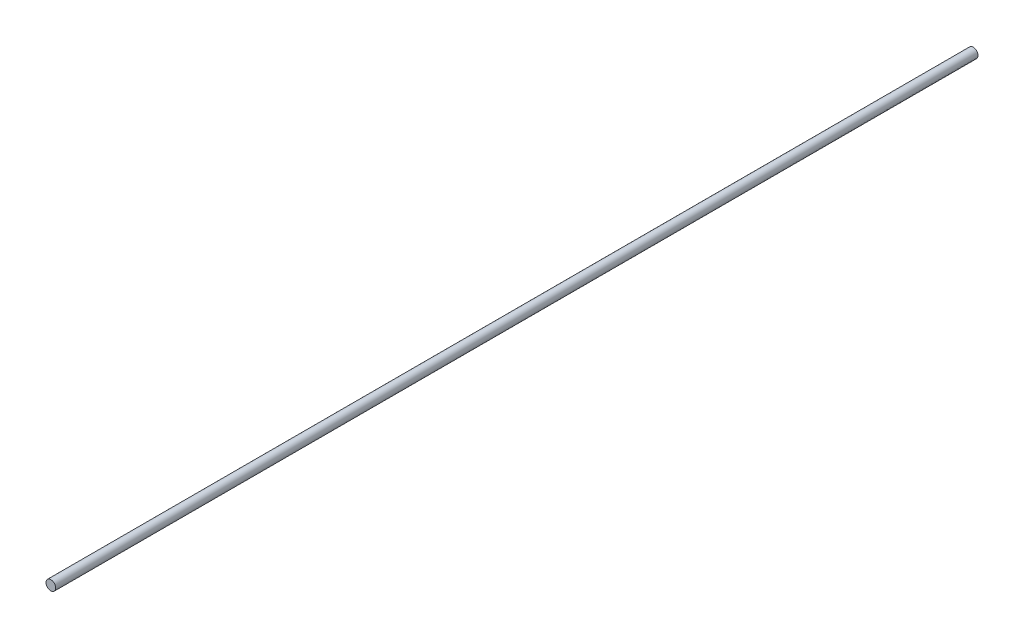
ISO-10303-21;
HEADER;
FILE_DESCRIPTION(('STEP AP214'),'2;1');
FILE_NAME('part.step','',(''),(''),'','','');
FILE_SCHEMA(('AUTOMOTIVE_DESIGN { 1 0 10303 214 1 1 1 1 }'));
ENDSEC;
DATA;
#1=APPLICATION_CONTEXT('core data for automotive mechanical design processes');
#2=APPLICATION_PROTOCOL_DEFINITION('international standard','automotive_design',2000,#1);
#3=PRODUCT_CONTEXT('',#1,'mechanical');
#4=PRODUCT('Part','Part','',(#3));
#5=PRODUCT_RELATED_PRODUCT_CATEGORY('part','',(#4));
#6=PRODUCT_DEFINITION_FORMATION('','',#4);
#7=PRODUCT_DEFINITION_CONTEXT('part definition',#1,'design');
#8=PRODUCT_DEFINITION('design','',#6,#7);
#9=PRODUCT_DEFINITION_SHAPE('','',#8);
#10=(LENGTH_UNIT() NAMED_UNIT(*) SI_UNIT(.MILLI.,.METRE.));
#11=(NAMED_UNIT(*) PLANE_ANGLE_UNIT() SI_UNIT($,.RADIAN.));
#12=(NAMED_UNIT(*) SI_UNIT($,.STERADIAN.) SOLID_ANGLE_UNIT());
#13=UNCERTAINTY_MEASURE_WITH_UNIT(LENGTH_MEASURE(1.E-05),#10,'distance_accuracy_value','');
#14=(GEOMETRIC_REPRESENTATION_CONTEXT(3) GLOBAL_UNCERTAINTY_ASSIGNED_CONTEXT((#13)) GLOBAL_UNIT_ASSIGNED_CONTEXT((#10,
#11,#12)) REPRESENTATION_CONTEXT('',''));
#15=CARTESIAN_POINT('',(0.,0.,0.));
#16=DIRECTION('',(0.,0.,1.));
#17=DIRECTION('',(1.,0.,0.));
#18=AXIS2_PLACEMENT_3D('',#15,#16,#17);
#19=CARTESIAN_POINT('',(0.,0.,190.));
#20=DIRECTION('',(0.,0.,-1.));
#21=DIRECTION('',(-1.,0.,0.));
#22=AXIS2_PLACEMENT_3D('',#19,#20,#21);
#23=CYLINDRICAL_SURFACE('',#22,1.);
#24=CARTESIAN_POINT('',(0.,0.,190.));
#25=DIRECTION('',(0.,0.,1.));
#26=DIRECTION('',(1.,0.,0.));
#27=AXIS2_PLACEMENT_3D('',#24,#25,#26);
#28=CIRCLE('',#27,1.);
#29=CARTESIAN_POINT('',(1.,0.,190.));
#30=VERTEX_POINT('',#29);
#31=EDGE_CURVE('E10',#30,#30,#28,.T.);
#32=ORIENTED_EDGE('',*,*,#31,.F.);
#33=EDGE_LOOP('',(#32));
#34=FACE_BOUND('',#33,.T.);
#35=CARTESIAN_POINT('',(0.,0.,0.));
#36=DIRECTION('',(0.,0.,1.));
#37=DIRECTION('',(1.,0.,0.));
#38=AXIS2_PLACEMENT_3D('',#35,#36,#37);
#39=CIRCLE('',#38,1.);
#40=CARTESIAN_POINT('',(1.,0.,0.));
#41=VERTEX_POINT('',#40);
#42=EDGE_CURVE('E34',#41,#41,#39,.T.);
#43=ORIENTED_EDGE('',*,*,#42,.T.);
#44=EDGE_LOOP('',(#43));
#45=FACE_BOUND('',#44,.T.);
#46=ADVANCED_FACE('F31',(#34,#45),#23,.T.);
#47=CARTESIAN_POINT('',(0.,0.,190.));
#48=DIRECTION('',(0.,0.,1.));
#49=DIRECTION('',(1.,0.,0.));
#50=AXIS2_PLACEMENT_3D('',#47,#48,#49);
#51=PLANE('',#50);
#52=ORIENTED_EDGE('',*,*,#31,.T.);
#53=EDGE_LOOP('',(#52));
#54=FACE_BOUND('',#53,.T.);
#55=ADVANCED_FACE('F46',(#54),#51,.T.);
#56=CARTESIAN_POINT('',(0.,0.,0.));
#57=DIRECTION('',(0.,0.,1.));
#58=DIRECTION('',(1.,0.,0.));
#59=AXIS2_PLACEMENT_3D('',#56,#57,#58);
#60=PLANE('',#59);
#61=ORIENTED_EDGE('',*,*,#42,.F.);
#62=EDGE_LOOP('',(#61));
#63=FACE_BOUND('',#62,.T.);
#64=ADVANCED_FACE('F44',(#63),#60,.F.);
#65=CLOSED_SHELL('',(#46,#55,#64));
#66=MANIFOLD_SOLID_BREP('B2',#65);
#67=ADVANCED_BREP_SHAPE_REPRESENTATION('',(#18,#66),#14);
#68=SHAPE_DEFINITION_REPRESENTATION(#9,#67);
ENDSEC;
END-ISO-10303-21;
